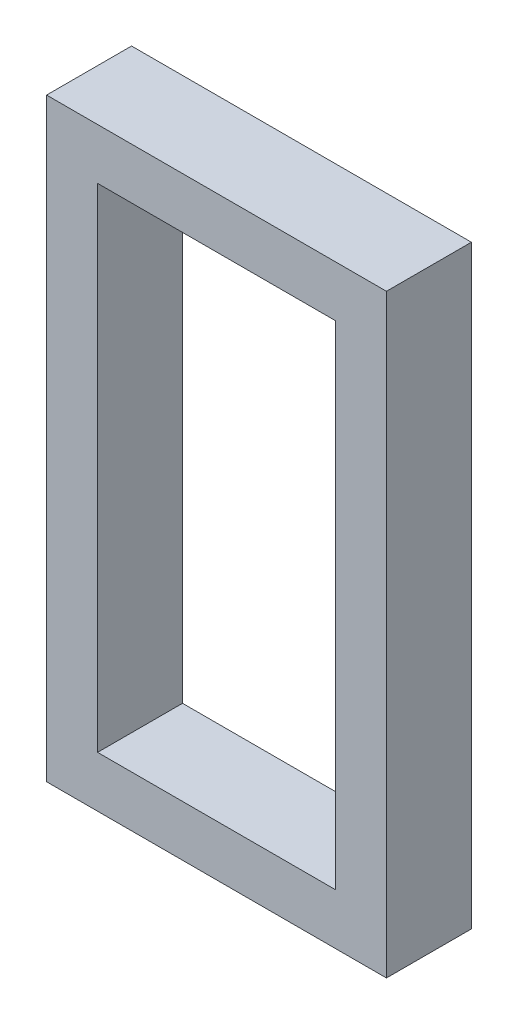
ISO-10303-21;
HEADER;
FILE_DESCRIPTION(('STEP AP214'),'2;1');
FILE_NAME('part.step','',(''),(''),'','','');
FILE_SCHEMA(('AUTOMOTIVE_DESIGN { 1 0 10303 214 1 1 1 1 }'));
ENDSEC;
DATA;
#1=APPLICATION_CONTEXT('core data for automotive mechanical design processes');
#2=APPLICATION_PROTOCOL_DEFINITION('international standard','automotive_design',2000,#1);
#3=PRODUCT_CONTEXT('',#1,'mechanical');
#4=PRODUCT('Part','Part','',(#3));
#5=PRODUCT_RELATED_PRODUCT_CATEGORY('part','',(#4));
#6=PRODUCT_DEFINITION_FORMATION('','',#4);
#7=PRODUCT_DEFINITION_CONTEXT('part definition',#1,'design');
#8=PRODUCT_DEFINITION('design','',#6,#7);
#9=PRODUCT_DEFINITION_SHAPE('','',#8);
#10=(LENGTH_UNIT() NAMED_UNIT(*) SI_UNIT(.MILLI.,.METRE.));
#11=(NAMED_UNIT(*) PLANE_ANGLE_UNIT() SI_UNIT($,.RADIAN.));
#12=(NAMED_UNIT(*) SI_UNIT($,.STERADIAN.) SOLID_ANGLE_UNIT());
#13=UNCERTAINTY_MEASURE_WITH_UNIT(LENGTH_MEASURE(1.E-05),#10,'distance_accuracy_value','');
#14=(GEOMETRIC_REPRESENTATION_CONTEXT(3) GLOBAL_UNCERTAINTY_ASSIGNED_CONTEXT((#13)) GLOBAL_UNIT_ASSIGNED_CONTEXT((#10,
#11,#12)) REPRESENTATION_CONTEXT('',''));
#15=CARTESIAN_POINT('',(0.,0.,0.));
#16=DIRECTION('',(0.,0.,1.));
#17=DIRECTION('',(1.,0.,0.));
#18=AXIS2_PLACEMENT_3D('',#15,#16,#17);
#19=CARTESIAN_POINT('',(-12.7,44.45,6.35));
#20=DIRECTION('',(1.,0.,0.));
#21=DIRECTION('',(0.,0.,-1.));
#22=AXIS2_PLACEMENT_3D('',#19,#20,#21);
#23=PLANE('',#22);
#24=DIRECTION('',(0.,-1.,0.));
#25=VECTOR('',#24,1.);
#26=CARTESIAN_POINT('',(-12.7,44.45,0.));
#27=LINE('',#26,#25);
#28=CARTESIAN_POINT('',(-12.7,44.45,0.));
#29=VERTEX_POINT('',#28);
#30=CARTESIAN_POINT('',(-12.7,0.,0.));
#31=VERTEX_POINT('',#30);
#32=EDGE_CURVE('E136',#29,#31,#27,.T.);
#33=ORIENTED_EDGE('',*,*,#32,.T.);
#34=DIRECTION('',(0.,0.,-1.));
#35=VECTOR('',#34,1.);
#36=CARTESIAN_POINT('',(-12.7,0.,6.35));
#37=LINE('',#36,#35);
#38=CARTESIAN_POINT('',(-12.7,0.,6.35));
#39=VERTEX_POINT('',#38);
#40=EDGE_CURVE('E11',#39,#31,#37,.T.);
#41=ORIENTED_EDGE('',*,*,#40,.F.);
#42=DIRECTION('',(0.,-1.,0.));
#43=VECTOR('',#42,1.);
#44=CARTESIAN_POINT('',(-12.7,44.45,6.35));
#45=LINE('',#44,#43);
#46=CARTESIAN_POINT('',(-12.7,44.45,6.35));
#47=VERTEX_POINT('',#46);
#48=EDGE_CURVE('E140',#47,#39,#45,.T.);
#49=ORIENTED_EDGE('',*,*,#48,.F.);
#50=DIRECTION('',(0.,0.,-1.));
#51=VECTOR('',#50,1.);
#52=CARTESIAN_POINT('',(-12.7,44.45,6.35));
#53=LINE('',#52,#51);
#54=EDGE_CURVE('E150',#47,#29,#53,.T.);
#55=ORIENTED_EDGE('',*,*,#54,.T.);
#56=EDGE_LOOP('',(#33,#41,#49,#55));
#57=FACE_BOUND('',#56,.T.);
#58=ADVANCED_FACE('F39',(#57),#23,.F.);
#59=CARTESIAN_POINT('',(-12.7,0.,6.35));
#60=DIRECTION('',(0.,1.,0.));
#61=DIRECTION('',(0.,0.,1.));
#62=AXIS2_PLACEMENT_3D('',#59,#60,#61);
#63=PLANE('',#62);
#64=DIRECTION('',(1.,0.,0.));
#65=VECTOR('',#64,1.);
#66=CARTESIAN_POINT('',(-12.7,0.,0.));
#67=LINE('',#66,#65);
#68=CARTESIAN_POINT('',(12.7,0.,0.));
#69=VERTEX_POINT('',#68);
#70=EDGE_CURVE('E153',#31,#69,#67,.T.);
#71=ORIENTED_EDGE('',*,*,#70,.T.);
#72=DIRECTION('',(0.,0.,-1.));
#73=VECTOR('',#72,1.);
#74=CARTESIAN_POINT('',(12.7,0.,6.35));
#75=LINE('',#74,#73);
#76=CARTESIAN_POINT('',(12.7,0.,6.35));
#77=VERTEX_POINT('',#76);
#78=EDGE_CURVE('E46',#77,#69,#75,.T.);
#79=ORIENTED_EDGE('',*,*,#78,.F.);
#80=DIRECTION('',(1.,0.,0.));
#81=VECTOR('',#80,1.);
#82=CARTESIAN_POINT('',(-12.7,0.,6.35));
#83=LINE('',#82,#81);
#84=EDGE_CURVE('E143',#39,#77,#83,.T.);
#85=ORIENTED_EDGE('',*,*,#84,.F.);
#86=ORIENTED_EDGE('',*,*,#40,.T.);
#87=EDGE_LOOP('',(#71,#79,#85,#86));
#88=FACE_BOUND('',#87,.T.);
#89=ADVANCED_FACE('F181',(#88),#63,.F.);
#90=CARTESIAN_POINT('',(12.7,0.,6.35));
#91=DIRECTION('',(-1.,0.,0.));
#92=DIRECTION('',(0.,0.,1.));
#93=AXIS2_PLACEMENT_3D('',#90,#91,#92);
#94=PLANE('',#93);
#95=DIRECTION('',(0.,1.,0.));
#96=VECTOR('',#95,1.);
#97=CARTESIAN_POINT('',(12.7,0.,0.));
#98=LINE('',#97,#96);
#99=CARTESIAN_POINT('',(12.7,44.45,0.));
#100=VERTEX_POINT('',#99);
#101=EDGE_CURVE('E155',#69,#100,#98,.T.);
#102=ORIENTED_EDGE('',*,*,#101,.T.);
#103=DIRECTION('',(0.,0.,-1.));
#104=VECTOR('',#103,1.);
#105=CARTESIAN_POINT('',(12.7,44.45,6.35));
#106=LINE('',#105,#104);
#107=CARTESIAN_POINT('',(12.7,44.45,6.35));
#108=VERTEX_POINT('',#107);
#109=EDGE_CURVE('E160',#108,#100,#106,.T.);
#110=ORIENTED_EDGE('',*,*,#109,.F.);
#111=DIRECTION('',(0.,1.,0.));
#112=VECTOR('',#111,1.);
#113=CARTESIAN_POINT('',(12.7,0.,6.35));
#114=LINE('',#113,#112);
#115=EDGE_CURVE('E146',#77,#108,#114,.T.);
#116=ORIENTED_EDGE('',*,*,#115,.F.);
#117=ORIENTED_EDGE('',*,*,#78,.T.);
#118=EDGE_LOOP('',(#102,#110,#116,#117));
#119=FACE_BOUND('',#118,.T.);
#120=ADVANCED_FACE('F167',(#119),#94,.F.);
#121=CARTESIAN_POINT('',(12.7,44.45,6.35));
#122=DIRECTION('',(0.,-1.,0.));
#123=DIRECTION('',(1.,0.,0.));
#124=AXIS2_PLACEMENT_3D('',#121,#122,#123);
#125=PLANE('',#124);
#126=DIRECTION('',(-1.,0.,0.));
#127=VECTOR('',#126,1.);
#128=CARTESIAN_POINT('',(12.7,44.45,0.));
#129=LINE('',#128,#127);
#130=EDGE_CURVE('E144',#100,#29,#129,.T.);
#131=ORIENTED_EDGE('',*,*,#130,.T.);
#132=ORIENTED_EDGE('',*,*,#54,.F.);
#133=DIRECTION('',(-1.,0.,0.));
#134=VECTOR('',#133,1.);
#135=CARTESIAN_POINT('',(12.7,44.45,6.35));
#136=LINE('',#135,#134);
#137=EDGE_CURVE('E148',#108,#47,#136,.T.);
#138=ORIENTED_EDGE('',*,*,#137,.F.);
#139=ORIENTED_EDGE('',*,*,#109,.T.);
#140=EDGE_LOOP('',(#131,#132,#138,#139));
#141=FACE_BOUND('',#140,.T.);
#142=ADVANCED_FACE('F174',(#141),#125,.F.);
#143=CARTESIAN_POINT('',(0.,0.,6.35));
#144=DIRECTION('',(0.,0.,1.));
#145=DIRECTION('',(1.,0.,0.));
#146=AXIS2_PLACEMENT_3D('',#143,#144,#145);
#147=PLANE('',#146);
#148=DIRECTION('',(-1.,0.,0.));
#149=VECTOR('',#148,1.);
#150=CARTESIAN_POINT('',(8.89,40.64,6.35));
#151=LINE('',#150,#149);
#152=CARTESIAN_POINT('',(8.89,40.64,6.35));
#153=VERTEX_POINT('',#152);
#154=CARTESIAN_POINT('',(-8.89,40.64,6.35));
#155=VERTEX_POINT('',#154);
#156=EDGE_CURVE('E53',#153,#155,#151,.T.);
#157=ORIENTED_EDGE('',*,*,#156,.F.);
#158=DIRECTION('',(0.,1.,0.));
#159=VECTOR('',#158,1.);
#160=CARTESIAN_POINT('',(8.89,3.81,6.35));
#161=LINE('',#160,#159);
#162=CARTESIAN_POINT('',(8.89,3.81,6.35));
#163=VERTEX_POINT('',#162);
#164=EDGE_CURVE('E121',#163,#153,#161,.T.);
#165=ORIENTED_EDGE('',*,*,#164,.F.);
#166=DIRECTION('',(1.,0.,0.));
#167=VECTOR('',#166,1.);
#168=CARTESIAN_POINT('',(-8.89,3.81,6.35));
#169=LINE('',#168,#167);
#170=CARTESIAN_POINT('',(-8.89,3.81,6.35));
#171=VERTEX_POINT('',#170);
#172=EDGE_CURVE('E124',#171,#163,#169,.T.);
#173=ORIENTED_EDGE('',*,*,#172,.F.);
#174=DIRECTION('',(0.,-1.,0.));
#175=VECTOR('',#174,1.);
#176=CARTESIAN_POINT('',(-8.89,40.64,6.35));
#177=LINE('',#176,#175);
#178=EDGE_CURVE('E130',#155,#171,#177,.T.);
#179=ORIENTED_EDGE('',*,*,#178,.F.);
#180=EDGE_LOOP('',(#157,#165,#173,#179));
#181=FACE_BOUND('',#180,.T.);
#182=ORIENTED_EDGE('',*,*,#48,.T.);
#183=ORIENTED_EDGE('',*,*,#84,.T.);
#184=ORIENTED_EDGE('',*,*,#115,.T.);
#185=ORIENTED_EDGE('',*,*,#137,.T.);
#186=EDGE_LOOP('',(#182,#183,#184,#185));
#187=FACE_BOUND('',#186,.T.);
#188=ADVANCED_FACE('F180',(#181,#187),#147,.T.);
#189=CARTESIAN_POINT('',(0.,0.,0.));
#190=DIRECTION('',(0.,0.,1.));
#191=DIRECTION('',(1.,0.,0.));
#192=AXIS2_PLACEMENT_3D('',#189,#190,#191);
#193=PLANE('',#192);
#194=DIRECTION('',(0.,1.,0.));
#195=VECTOR('',#194,1.);
#196=CARTESIAN_POINT('',(8.89,3.81,0.));
#197=LINE('',#196,#195);
#198=CARTESIAN_POINT('',(8.89,3.81,0.));
#199=VERTEX_POINT('',#198);
#200=CARTESIAN_POINT('',(8.89,40.64,0.));
#201=VERTEX_POINT('',#200);
#202=EDGE_CURVE('E111',#199,#201,#197,.T.);
#203=ORIENTED_EDGE('',*,*,#202,.T.);
#204=DIRECTION('',(-1.,0.,0.));
#205=VECTOR('',#204,1.);
#206=CARTESIAN_POINT('',(8.89,40.64,0.));
#207=LINE('',#206,#205);
#208=CARTESIAN_POINT('',(-8.89,40.64,0.));
#209=VERTEX_POINT('',#208);
#210=EDGE_CURVE('E105',#201,#209,#207,.T.);
#211=ORIENTED_EDGE('',*,*,#210,.T.);
#212=DIRECTION('',(0.,-1.,0.));
#213=VECTOR('',#212,1.);
#214=CARTESIAN_POINT('',(-8.89,40.64,0.));
#215=LINE('',#214,#213);
#216=CARTESIAN_POINT('',(-8.89,3.81,0.));
#217=VERTEX_POINT('',#216);
#218=EDGE_CURVE('E114',#209,#217,#215,.T.);
#219=ORIENTED_EDGE('',*,*,#218,.T.);
#220=DIRECTION('',(1.,0.,0.));
#221=VECTOR('',#220,1.);
#222=CARTESIAN_POINT('',(-8.89,3.81,0.));
#223=LINE('',#222,#221);
#224=EDGE_CURVE('E61',#217,#199,#223,.T.);
#225=ORIENTED_EDGE('',*,*,#224,.T.);
#226=EDGE_LOOP('',(#203,#211,#219,#225));
#227=FACE_BOUND('',#226,.T.);
#228=ORIENTED_EDGE('',*,*,#32,.F.);
#229=ORIENTED_EDGE('',*,*,#130,.F.);
#230=ORIENTED_EDGE('',*,*,#101,.F.);
#231=ORIENTED_EDGE('',*,*,#70,.F.);
#232=EDGE_LOOP('',(#228,#229,#230,#231));
#233=FACE_BOUND('',#232,.T.);
#234=ADVANCED_FACE('F118',(#227,#233),#193,.F.);
#235=CARTESIAN_POINT('',(8.89,40.64,0.));
#236=DIRECTION('',(0.,1.,0.));
#237=DIRECTION('',(-1.,0.,0.));
#238=AXIS2_PLACEMENT_3D('',#235,#236,#237);
#239=PLANE('',#238);
#240=ORIENTED_EDGE('',*,*,#156,.T.);
#241=DIRECTION('',(0.,0.,1.));
#242=VECTOR('',#241,1.);
#243=CARTESIAN_POINT('',(-8.89,40.64,0.));
#244=LINE('',#243,#242);
#245=EDGE_CURVE('E101',#209,#155,#244,.T.);
#246=ORIENTED_EDGE('',*,*,#245,.F.);
#247=ORIENTED_EDGE('',*,*,#210,.F.);
#248=DIRECTION('',(0.,0.,1.));
#249=VECTOR('',#248,1.);
#250=CARTESIAN_POINT('',(8.89,40.64,0.));
#251=LINE('',#250,#249);
#252=EDGE_CURVE('E134',#201,#153,#251,.T.);
#253=ORIENTED_EDGE('',*,*,#252,.T.);
#254=EDGE_LOOP('',(#240,#246,#247,#253));
#255=FACE_BOUND('',#254,.T.);
#256=ADVANCED_FACE('F103',(#255),#239,.F.);
#257=CARTESIAN_POINT('',(8.89,3.81,0.));
#258=DIRECTION('',(1.,0.,0.));
#259=DIRECTION('',(0.,0.,-1.));
#260=AXIS2_PLACEMENT_3D('',#257,#258,#259);
#261=PLANE('',#260);
#262=ORIENTED_EDGE('',*,*,#164,.T.);
#263=ORIENTED_EDGE('',*,*,#252,.F.);
#264=ORIENTED_EDGE('',*,*,#202,.F.);
#265=DIRECTION('',(0.,0.,1.));
#266=VECTOR('',#265,1.);
#267=CARTESIAN_POINT('',(8.89,3.81,0.));
#268=LINE('',#267,#266);
#269=EDGE_CURVE('E137',#199,#163,#268,.T.);
#270=ORIENTED_EDGE('',*,*,#269,.T.);
#271=EDGE_LOOP('',(#262,#263,#264,#270));
#272=FACE_BOUND('',#271,.T.);
#273=ADVANCED_FACE('F198',(#272),#261,.F.);
#274=CARTESIAN_POINT('',(-8.89,3.81,0.));
#275=DIRECTION('',(0.,-1.,0.));
#276=DIRECTION('',(0.,0.,-1.));
#277=AXIS2_PLACEMENT_3D('',#274,#275,#276);
#278=PLANE('',#277);
#279=ORIENTED_EDGE('',*,*,#172,.T.);
#280=ORIENTED_EDGE('',*,*,#269,.F.);
#281=ORIENTED_EDGE('',*,*,#224,.F.);
#282=DIRECTION('',(0.,0.,1.));
#283=VECTOR('',#282,1.);
#284=CARTESIAN_POINT('',(-8.89,3.81,0.));
#285=LINE('',#284,#283);
#286=EDGE_CURVE('E110',#217,#171,#285,.T.);
#287=ORIENTED_EDGE('',*,*,#286,.T.);
#288=EDGE_LOOP('',(#279,#280,#281,#287));
#289=FACE_BOUND('',#288,.T.);
#290=ADVANCED_FACE('F201',(#289),#278,.F.);
#291=CARTESIAN_POINT('',(-8.89,40.64,0.));
#292=DIRECTION('',(-1.,0.,0.));
#293=DIRECTION('',(0.,0.,1.));
#294=AXIS2_PLACEMENT_3D('',#291,#292,#293);
#295=PLANE('',#294);
#296=ORIENTED_EDGE('',*,*,#178,.T.);
#297=ORIENTED_EDGE('',*,*,#286,.F.);
#298=ORIENTED_EDGE('',*,*,#218,.F.);
#299=ORIENTED_EDGE('',*,*,#245,.T.);
#300=EDGE_LOOP('',(#296,#297,#298,#299));
#301=FACE_BOUND('',#300,.T.);
#302=ADVANCED_FACE('F115',(#301),#295,.F.);
#303=CLOSED_SHELL('',(#58,#89,#120,#142,#188,#234,#256,#273,#290,#302));
#304=MANIFOLD_SOLID_BREP('B2',#303);
#305=ADVANCED_BREP_SHAPE_REPRESENTATION('',(#18,#304),#14);
#306=SHAPE_DEFINITION_REPRESENTATION(#9,#305);
ENDSEC;
END-ISO-10303-21;
